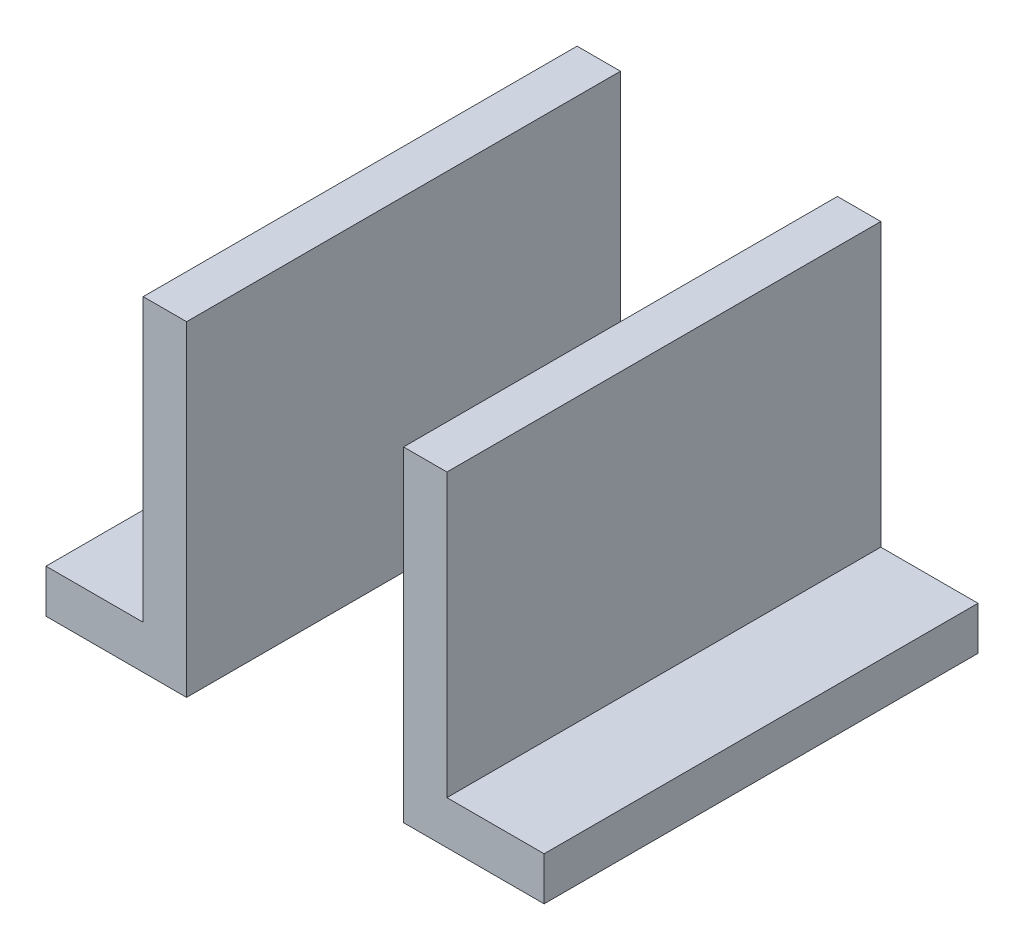
ISO-10303-21;
HEADER;
FILE_DESCRIPTION(('STEP AP214'),'2;1');
FILE_NAME('part.step','',(''),(''),'','','');
FILE_SCHEMA(('AUTOMOTIVE_DESIGN { 1 0 10303 214 1 1 1 1 }'));
ENDSEC;
DATA;
#1=APPLICATION_CONTEXT('core data for automotive mechanical design processes');
#2=APPLICATION_PROTOCOL_DEFINITION('international standard','automotive_design',2000,#1);
#3=PRODUCT_CONTEXT('',#1,'mechanical');
#4=PRODUCT('Part','Part','',(#3));
#5=PRODUCT_RELATED_PRODUCT_CATEGORY('part','',(#4));
#6=PRODUCT_DEFINITION_FORMATION('','',#4);
#7=PRODUCT_DEFINITION_CONTEXT('part definition',#1,'design');
#8=PRODUCT_DEFINITION('design','',#6,#7);
#9=PRODUCT_DEFINITION_SHAPE('','',#8);
#10=(LENGTH_UNIT() NAMED_UNIT(*) SI_UNIT(.MILLI.,.METRE.));
#11=(NAMED_UNIT(*) PLANE_ANGLE_UNIT() SI_UNIT($,.RADIAN.));
#12=(NAMED_UNIT(*) SI_UNIT($,.STERADIAN.) SOLID_ANGLE_UNIT());
#13=UNCERTAINTY_MEASURE_WITH_UNIT(LENGTH_MEASURE(1.E-05),#10,'distance_accuracy_value','');
#14=(GEOMETRIC_REPRESENTATION_CONTEXT(3) GLOBAL_UNCERTAINTY_ASSIGNED_CONTEXT((#13)) GLOBAL_UNIT_ASSIGNED_CONTEXT((#10,
#11,#12)) REPRESENTATION_CONTEXT('',''));
#15=CARTESIAN_POINT('',(0.,0.,0.));
#16=DIRECTION('',(0.,0.,1.));
#17=DIRECTION('',(1.,0.,0.));
#18=AXIS2_PLACEMENT_3D('',#15,#16,#17);
#19=CARTESIAN_POINT('',(-57.4040103991189,-35.4855461768779,100.));
#20=DIRECTION('',(1.,0.,0.));
#21=DIRECTION('',(0.,1.,0.));
#22=AXIS2_PLACEMENT_3D('',#19,#20,#21);
#23=PLANE('',#22);
#24=DIRECTION('',(0.,-1.,0.));
#25=VECTOR('',#24,1.);
#26=CARTESIAN_POINT('',(-57.4040103991189,-35.4855461768779,0.));
#27=LINE('',#26,#25);
#28=CARTESIAN_POINT('',(-57.4040103991189,-35.4855461768779,0.));
#29=VERTEX_POINT('',#28);
#30=CARTESIAN_POINT('',(-57.4040103991189,-45.4855461768779,0.));
#31=VERTEX_POINT('',#30);
#32=EDGE_CURVE('E129',#29,#31,#27,.T.);
#33=ORIENTED_EDGE('',*,*,#32,.T.);
#34=DIRECTION('',(0.,0.,-1.));
#35=VECTOR('',#34,1.);
#36=CARTESIAN_POINT('',(-57.4040103991189,-45.4855461768779,100.));
#37=LINE('',#36,#35);
#38=CARTESIAN_POINT('',(-57.4040103991189,-45.4855461768779,100.));
#39=VERTEX_POINT('',#38);
#40=EDGE_CURVE('E12',#39,#31,#37,.T.);
#41=ORIENTED_EDGE('',*,*,#40,.F.);
#42=DIRECTION('',(0.,-1.,0.));
#43=VECTOR('',#42,1.);
#44=CARTESIAN_POINT('',(-57.4040103991189,-35.4855461768779,100.));
#45=LINE('',#44,#43);
#46=CARTESIAN_POINT('',(-57.4040103991189,-35.4855461768779,100.));
#47=VERTEX_POINT('',#46);
#48=EDGE_CURVE('E139',#47,#39,#45,.T.);
#49=ORIENTED_EDGE('',*,*,#48,.F.);
#50=DIRECTION('',(0.,0.,-1.));
#51=VECTOR('',#50,1.);
#52=CARTESIAN_POINT('',(-57.4040103991189,-35.4855461768779,100.));
#53=LINE('',#52,#51);
#54=EDGE_CURVE('E125',#47,#29,#53,.T.);
#55=ORIENTED_EDGE('',*,*,#54,.T.);
#56=EDGE_LOOP('',(#33,#41,#49,#55));
#57=FACE_BOUND('',#56,.T.);
#58=ADVANCED_FACE('F45',(#57),#23,.F.);
#59=CARTESIAN_POINT('',(-57.4040103991189,-45.4855461768779,100.));
#60=DIRECTION('',(0.,1.,0.));
#61=DIRECTION('',(0.,0.,1.));
#62=AXIS2_PLACEMENT_3D('',#59,#60,#61);
#63=PLANE('',#62);
#64=DIRECTION('',(1.,0.,0.));
#65=VECTOR('',#64,1.);
#66=CARTESIAN_POINT('',(-57.4040103991189,-45.4855461768779,0.));
#67=LINE('',#66,#65);
#68=CARTESIAN_POINT('',(-25.,-45.4855461768779,0.));
#69=VERTEX_POINT('',#68);
#70=EDGE_CURVE('E132',#31,#69,#67,.T.);
#71=ORIENTED_EDGE('',*,*,#70,.T.);
#72=DIRECTION('',(0.,0.,-1.));
#73=VECTOR('',#72,1.);
#74=CARTESIAN_POINT('',(-25.,-45.4855461768779,100.));
#75=LINE('',#74,#73);
#76=CARTESIAN_POINT('',(-25.,-45.4855461768779,100.));
#77=VERTEX_POINT('',#76);
#78=EDGE_CURVE('E53',#77,#69,#75,.T.);
#79=ORIENTED_EDGE('',*,*,#78,.F.);
#80=DIRECTION('',(1.,0.,0.));
#81=VECTOR('',#80,1.);
#82=CARTESIAN_POINT('',(-57.4040103991189,-45.4855461768779,100.));
#83=LINE('',#82,#81);
#84=EDGE_CURVE('E98',#39,#77,#83,.T.);
#85=ORIENTED_EDGE('',*,*,#84,.F.);
#86=ORIENTED_EDGE('',*,*,#40,.T.);
#87=EDGE_LOOP('',(#71,#79,#85,#86));
#88=FACE_BOUND('',#87,.T.);
#89=ADVANCED_FACE('F163',(#88),#63,.F.);
#90=CARTESIAN_POINT('',(-25.,29.5144538231221,100.));
#91=DIRECTION('',(-1.,0.,0.));
#92=DIRECTION('',(0.,-1.,0.));
#93=AXIS2_PLACEMENT_3D('',#90,#91,#92);
#94=PLANE('',#93);
#95=DIRECTION('',(0.,1.,0.));
#96=VECTOR('',#95,1.);
#97=CARTESIAN_POINT('',(-25.,29.5144538231221,0.));
#98=LINE('',#97,#96);
#99=CARTESIAN_POINT('',(-25.,29.5144538231221,0.));
#100=VERTEX_POINT('',#99);
#101=EDGE_CURVE('E134',#69,#100,#98,.T.);
#102=ORIENTED_EDGE('',*,*,#101,.T.);
#103=DIRECTION('',(0.,0.,-1.));
#104=VECTOR('',#103,1.);
#105=CARTESIAN_POINT('',(-25.,29.5144538231221,100.));
#106=LINE('',#105,#104);
#107=CARTESIAN_POINT('',(-25.,29.5144538231221,100.));
#108=VERTEX_POINT('',#107);
#109=EDGE_CURVE('E120',#108,#100,#106,.T.);
#110=ORIENTED_EDGE('',*,*,#109,.F.);
#111=DIRECTION('',(0.,1.,0.));
#112=VECTOR('',#111,1.);
#113=CARTESIAN_POINT('',(-25.,29.5144538231221,100.));
#114=LINE('',#113,#112);
#115=EDGE_CURVE('E111',#77,#108,#114,.T.);
#116=ORIENTED_EDGE('',*,*,#115,.F.);
#117=ORIENTED_EDGE('',*,*,#78,.T.);
#118=EDGE_LOOP('',(#102,#110,#116,#117));
#119=FACE_BOUND('',#118,.T.);
#120=ADVANCED_FACE('F145',(#119),#94,.F.);
#121=CARTESIAN_POINT('',(-25.,29.5144538231221,100.));
#122=DIRECTION('',(0.,-1.,0.));
#123=DIRECTION('',(0.,0.,-1.));
#124=AXIS2_PLACEMENT_3D('',#121,#122,#123);
#125=PLANE('',#124);
#126=DIRECTION('',(-1.,0.,0.));
#127=VECTOR('',#126,1.);
#128=CARTESIAN_POINT('',(-25.,29.5144538231221,0.));
#129=LINE('',#128,#127);
#130=CARTESIAN_POINT('',(-35.,29.5144538231221,0.));
#131=VERTEX_POINT('',#130);
#132=EDGE_CURVE('E119',#100,#131,#129,.T.);
#133=ORIENTED_EDGE('',*,*,#132,.T.);
#134=DIRECTION('',(0.,0.,-1.));
#135=VECTOR('',#134,1.);
#136=CARTESIAN_POINT('',(-35.,29.5144538231221,100.));
#137=LINE('',#136,#135);
#138=CARTESIAN_POINT('',(-35.,29.5144538231221,100.));
#139=VERTEX_POINT('',#138);
#140=EDGE_CURVE('E116',#139,#131,#137,.T.);
#141=ORIENTED_EDGE('',*,*,#140,.F.);
#142=DIRECTION('',(-1.,0.,0.));
#143=VECTOR('',#142,1.);
#144=CARTESIAN_POINT('',(-25.,29.5144538231221,100.));
#145=LINE('',#144,#143);
#146=EDGE_CURVE('E105',#108,#139,#145,.T.);
#147=ORIENTED_EDGE('',*,*,#146,.F.);
#148=ORIENTED_EDGE('',*,*,#109,.T.);
#149=EDGE_LOOP('',(#133,#141,#147,#148));
#150=FACE_BOUND('',#149,.T.);
#151=ADVANCED_FACE('F117',(#150),#125,.F.);
#152=CARTESIAN_POINT('',(-35.,29.5144538231221,100.));
#153=DIRECTION('',(1.,0.,0.));
#154=DIRECTION('',(0.,1.,0.));
#155=AXIS2_PLACEMENT_3D('',#152,#153,#154);
#156=PLANE('',#155);
#157=DIRECTION('',(0.,-1.,0.));
#158=VECTOR('',#157,1.);
#159=CARTESIAN_POINT('',(-35.,29.5144538231221,0.));
#160=LINE('',#159,#158);
#161=CARTESIAN_POINT('',(-35.,-35.4855461768779,0.));
#162=VERTEX_POINT('',#161);
#163=EDGE_CURVE('E84',#131,#162,#160,.T.);
#164=ORIENTED_EDGE('',*,*,#163,.T.);
#165=DIRECTION('',(0.,0.,-1.));
#166=VECTOR('',#165,1.);
#167=CARTESIAN_POINT('',(-35.,-35.4855461768779,100.));
#168=LINE('',#167,#166);
#169=CARTESIAN_POINT('',(-35.,-35.4855461768779,100.));
#170=VERTEX_POINT('',#169);
#171=EDGE_CURVE('E121',#170,#162,#168,.T.);
#172=ORIENTED_EDGE('',*,*,#171,.F.);
#173=DIRECTION('',(0.,-1.,0.));
#174=VECTOR('',#173,1.);
#175=CARTESIAN_POINT('',(-35.,29.5144538231221,100.));
#176=LINE('',#175,#174);
#177=EDGE_CURVE('E109',#139,#170,#176,.T.);
#178=ORIENTED_EDGE('',*,*,#177,.F.);
#179=ORIENTED_EDGE('',*,*,#140,.T.);
#180=EDGE_LOOP('',(#164,#172,#178,#179));
#181=FACE_BOUND('',#180,.T.);
#182=ADVANCED_FACE('F123',(#181),#156,.F.);
#183=CARTESIAN_POINT('',(-35.,-35.4855461768779,100.));
#184=DIRECTION('',(0.,-1.,0.));
#185=DIRECTION('',(0.,0.,-1.));
#186=AXIS2_PLACEMENT_3D('',#183,#184,#185);
#187=PLANE('',#186);
#188=DIRECTION('',(-1.,0.,0.));
#189=VECTOR('',#188,1.);
#190=CARTESIAN_POINT('',(-35.,-35.4855461768779,0.));
#191=LINE('',#190,#189);
#192=EDGE_CURVE('E90',#162,#29,#191,.T.);
#193=ORIENTED_EDGE('',*,*,#192,.T.);
#194=ORIENTED_EDGE('',*,*,#54,.F.);
#195=DIRECTION('',(-1.,0.,0.));
#196=VECTOR('',#195,1.);
#197=CARTESIAN_POINT('',(-35.,-35.4855461768779,100.));
#198=LINE('',#197,#196);
#199=EDGE_CURVE('E61',#170,#47,#198,.T.);
#200=ORIENTED_EDGE('',*,*,#199,.F.);
#201=ORIENTED_EDGE('',*,*,#171,.T.);
#202=EDGE_LOOP('',(#193,#194,#200,#201));
#203=FACE_BOUND('',#202,.T.);
#204=ADVANCED_FACE('F152',(#203),#187,.F.);
#205=CARTESIAN_POINT('',(0.,0.,100.));
#206=DIRECTION('',(0.,0.,1.));
#207=DIRECTION('',(1.,0.,0.));
#208=AXIS2_PLACEMENT_3D('',#205,#206,#207);
#209=PLANE('',#208);
#210=ORIENTED_EDGE('',*,*,#48,.T.);
#211=ORIENTED_EDGE('',*,*,#84,.T.);
#212=ORIENTED_EDGE('',*,*,#115,.T.);
#213=ORIENTED_EDGE('',*,*,#146,.T.);
#214=ORIENTED_EDGE('',*,*,#177,.T.);
#215=ORIENTED_EDGE('',*,*,#199,.T.);
#216=EDGE_LOOP('',(#210,#211,#212,#213,#214,#215));
#217=FACE_BOUND('',#216,.T.);
#218=ADVANCED_FACE('F107',(#217),#209,.T.);
#219=CARTESIAN_POINT('',(0.,0.,0.));
#220=DIRECTION('',(0.,0.,1.));
#221=DIRECTION('',(1.,0.,0.));
#222=AXIS2_PLACEMENT_3D('',#219,#220,#221);
#223=PLANE('',#222);
#224=ORIENTED_EDGE('',*,*,#32,.F.);
#225=ORIENTED_EDGE('',*,*,#192,.F.);
#226=ORIENTED_EDGE('',*,*,#163,.F.);
#227=ORIENTED_EDGE('',*,*,#132,.F.);
#228=ORIENTED_EDGE('',*,*,#101,.F.);
#229=ORIENTED_EDGE('',*,*,#70,.F.);
#230=EDGE_LOOP('',(#224,#225,#226,#227,#228,#229));
#231=FACE_BOUND('',#230,.T.);
#232=ADVANCED_FACE('F148',(#231),#223,.F.);
#233=CLOSED_SHELL('',(#58,#89,#120,#151,#182,#204,#218,#232));
#234=MANIFOLD_SOLID_BREP('B2',#233);
#235=CARTESIAN_POINT('',(25.,29.5144538231221,100.));
#236=DIRECTION('',(1.,0.,0.));
#237=DIRECTION('',(0.,1.,0.));
#238=AXIS2_PLACEMENT_3D('',#235,#236,#237);
#239=PLANE('',#238);
#240=DIRECTION('',(0.,-1.,0.));
#241=VECTOR('',#240,1.);
#242=CARTESIAN_POINT('',(25.,29.5144538231221,0.));
#243=LINE('',#242,#241);
#244=CARTESIAN_POINT('',(25.,29.5144538231221,0.));
#245=VERTEX_POINT('',#244);
#246=CARTESIAN_POINT('',(25.,-45.4855461768779,0.));
#247=VERTEX_POINT('',#246);
#248=EDGE_CURVE('E305',#245,#247,#243,.T.);
#249=ORIENTED_EDGE('',*,*,#248,.T.);
#250=DIRECTION('',(0.,0.,-1.));
#251=VECTOR('',#250,1.);
#252=CARTESIAN_POINT('',(25.,-45.4855461768779,100.));
#253=LINE('',#252,#251);
#254=CARTESIAN_POINT('',(25.,-45.4855461768779,100.));
#255=VERTEX_POINT('',#254);
#256=EDGE_CURVE('E43',#255,#247,#253,.T.);
#257=ORIENTED_EDGE('',*,*,#256,.F.);
#258=DIRECTION('',(0.,-1.,0.));
#259=VECTOR('',#258,1.);
#260=CARTESIAN_POINT('',(25.,29.5144538231221,100.));
#261=LINE('',#260,#259);
#262=CARTESIAN_POINT('',(25.,29.5144538231221,100.));
#263=VERTEX_POINT('',#262);
#264=EDGE_CURVE('E315',#263,#255,#261,.T.);
#265=ORIENTED_EDGE('',*,*,#264,.F.);
#266=DIRECTION('',(0.,0.,-1.));
#267=VECTOR('',#266,1.);
#268=CARTESIAN_POINT('',(25.,29.5144538231221,100.));
#269=LINE('',#268,#267);
#270=EDGE_CURVE('E301',#263,#245,#269,.T.);
#271=ORIENTED_EDGE('',*,*,#270,.T.);
#272=EDGE_LOOP('',(#249,#257,#265,#271));
#273=FACE_BOUND('',#272,.T.);
#274=ADVANCED_FACE('F221',(#273),#239,.F.);
#275=CARTESIAN_POINT('',(57.4040103991189,-45.4855461768779,100.));
#276=DIRECTION('',(0.,1.,0.));
#277=DIRECTION('',(0.,0.,1.));
#278=AXIS2_PLACEMENT_3D('',#275,#276,#277);
#279=PLANE('',#278);
#280=DIRECTION('',(1.,0.,0.));
#281=VECTOR('',#280,1.);
#282=CARTESIAN_POINT('',(57.4040103991189,-45.4855461768779,0.));
#283=LINE('',#282,#281);
#284=CARTESIAN_POINT('',(57.4040103991189,-45.4855461768779,0.));
#285=VERTEX_POINT('',#284);
#286=EDGE_CURVE('E308',#247,#285,#283,.T.);
#287=ORIENTED_EDGE('',*,*,#286,.T.);
#288=DIRECTION('',(0.,0.,-1.));
#289=VECTOR('',#288,1.);
#290=CARTESIAN_POINT('',(57.4040103991189,-45.4855461768779,100.));
#291=LINE('',#290,#289);
#292=CARTESIAN_POINT('',(57.4040103991189,-45.4855461768779,100.));
#293=VERTEX_POINT('',#292);
#294=EDGE_CURVE('E229',#293,#285,#291,.T.);
#295=ORIENTED_EDGE('',*,*,#294,.F.);
#296=DIRECTION('',(1.,0.,0.));
#297=VECTOR('',#296,1.);
#298=CARTESIAN_POINT('',(57.4040103991189,-45.4855461768779,100.));
#299=LINE('',#298,#297);
#300=EDGE_CURVE('E274',#255,#293,#299,.T.);
#301=ORIENTED_EDGE('',*,*,#300,.F.);
#302=ORIENTED_EDGE('',*,*,#256,.T.);
#303=EDGE_LOOP('',(#287,#295,#301,#302));
#304=FACE_BOUND('',#303,.T.);
#305=ADVANCED_FACE('F339',(#304),#279,.F.);
#306=CARTESIAN_POINT('',(57.4040103991189,-35.4855461768779,100.));
#307=DIRECTION('',(-1.,0.,0.));
#308=DIRECTION('',(0.,-1.,0.));
#309=AXIS2_PLACEMENT_3D('',#306,#307,#308);
#310=PLANE('',#309);
#311=DIRECTION('',(0.,1.,0.));
#312=VECTOR('',#311,1.);
#313=CARTESIAN_POINT('',(57.4040103991189,-35.4855461768779,0.));
#314=LINE('',#313,#312);
#315=CARTESIAN_POINT('',(57.4040103991189,-35.4855461768779,0.));
#316=VERTEX_POINT('',#315);
#317=EDGE_CURVE('E310',#285,#316,#314,.T.);
#318=ORIENTED_EDGE('',*,*,#317,.T.);
#319=DIRECTION('',(0.,0.,-1.));
#320=VECTOR('',#319,1.);
#321=CARTESIAN_POINT('',(57.4040103991189,-35.4855461768779,100.));
#322=LINE('',#321,#320);
#323=CARTESIAN_POINT('',(57.4040103991189,-35.4855461768779,100.));
#324=VERTEX_POINT('',#323);
#325=EDGE_CURVE('E296',#324,#316,#322,.T.);
#326=ORIENTED_EDGE('',*,*,#325,.F.);
#327=DIRECTION('',(0.,1.,0.));
#328=VECTOR('',#327,1.);
#329=CARTESIAN_POINT('',(57.4040103991189,-35.4855461768779,100.));
#330=LINE('',#329,#328);
#331=EDGE_CURVE('E287',#293,#324,#330,.T.);
#332=ORIENTED_EDGE('',*,*,#331,.F.);
#333=ORIENTED_EDGE('',*,*,#294,.T.);
#334=EDGE_LOOP('',(#318,#326,#332,#333));
#335=FACE_BOUND('',#334,.T.);
#336=ADVANCED_FACE('F321',(#335),#310,.F.);
#337=CARTESIAN_POINT('',(35.,-35.4855461768779,100.));
#338=DIRECTION('',(0.,-1.,0.));
#339=DIRECTION('',(0.,0.,-1.));
#340=AXIS2_PLACEMENT_3D('',#337,#338,#339);
#341=PLANE('',#340);
#342=DIRECTION('',(-1.,0.,0.));
#343=VECTOR('',#342,1.);
#344=CARTESIAN_POINT('',(35.,-35.4855461768779,0.));
#345=LINE('',#344,#343);
#346=CARTESIAN_POINT('',(35.,-35.4855461768779,0.));
#347=VERTEX_POINT('',#346);
#348=EDGE_CURVE('E295',#316,#347,#345,.T.);
#349=ORIENTED_EDGE('',*,*,#348,.T.);
#350=DIRECTION('',(0.,0.,-1.));
#351=VECTOR('',#350,1.);
#352=CARTESIAN_POINT('',(35.,-35.4855461768779,100.));
#353=LINE('',#352,#351);
#354=CARTESIAN_POINT('',(35.,-35.4855461768779,100.));
#355=VERTEX_POINT('',#354);
#356=EDGE_CURVE('E292',#355,#347,#353,.T.);
#357=ORIENTED_EDGE('',*,*,#356,.F.);
#358=DIRECTION('',(-1.,0.,0.));
#359=VECTOR('',#358,1.);
#360=CARTESIAN_POINT('',(35.,-35.4855461768779,100.));
#361=LINE('',#360,#359);
#362=EDGE_CURVE('E281',#324,#355,#361,.T.);
#363=ORIENTED_EDGE('',*,*,#362,.F.);
#364=ORIENTED_EDGE('',*,*,#325,.T.);
#365=EDGE_LOOP('',(#349,#357,#363,#364));
#366=FACE_BOUND('',#365,.T.);
#367=ADVANCED_FACE('F293',(#366),#341,.F.);
#368=CARTESIAN_POINT('',(35.,29.5144538231221,100.));
#369=DIRECTION('',(-1.,0.,0.));
#370=DIRECTION('',(0.,-1.,0.));
#371=AXIS2_PLACEMENT_3D('',#368,#369,#370);
#372=PLANE('',#371);
#373=DIRECTION('',(0.,1.,0.));
#374=VECTOR('',#373,1.);
#375=CARTESIAN_POINT('',(35.,29.5144538231221,0.));
#376=LINE('',#375,#374);
#377=CARTESIAN_POINT('',(35.,29.5144538231221,0.));
#378=VERTEX_POINT('',#377);
#379=EDGE_CURVE('E260',#347,#378,#376,.T.);
#380=ORIENTED_EDGE('',*,*,#379,.T.);
#381=DIRECTION('',(0.,0.,-1.));
#382=VECTOR('',#381,1.);
#383=CARTESIAN_POINT('',(35.,29.5144538231221,100.));
#384=LINE('',#383,#382);
#385=CARTESIAN_POINT('',(35.,29.5144538231221,100.));
#386=VERTEX_POINT('',#385);
#387=EDGE_CURVE('E297',#386,#378,#384,.T.);
#388=ORIENTED_EDGE('',*,*,#387,.F.);
#389=DIRECTION('',(0.,1.,0.));
#390=VECTOR('',#389,1.);
#391=CARTESIAN_POINT('',(35.,29.5144538231221,100.));
#392=LINE('',#391,#390);
#393=EDGE_CURVE('E285',#355,#386,#392,.T.);
#394=ORIENTED_EDGE('',*,*,#393,.F.);
#395=ORIENTED_EDGE('',*,*,#356,.T.);
#396=EDGE_LOOP('',(#380,#388,#394,#395));
#397=FACE_BOUND('',#396,.T.);
#398=ADVANCED_FACE('F299',(#397),#372,.F.);
#399=CARTESIAN_POINT('',(25.,29.5144538231221,100.));
#400=DIRECTION('',(0.,-1.,0.));
#401=DIRECTION('',(0.,0.,-1.));
#402=AXIS2_PLACEMENT_3D('',#399,#400,#401);
#403=PLANE('',#402);
#404=DIRECTION('',(-1.,0.,0.));
#405=VECTOR('',#404,1.);
#406=CARTESIAN_POINT('',(25.,29.5144538231221,0.));
#407=LINE('',#406,#405);
#408=EDGE_CURVE('E266',#378,#245,#407,.T.);
#409=ORIENTED_EDGE('',*,*,#408,.T.);
#410=ORIENTED_EDGE('',*,*,#270,.F.);
#411=DIRECTION('',(-1.,0.,0.));
#412=VECTOR('',#411,1.);
#413=CARTESIAN_POINT('',(25.,29.5144538231221,100.));
#414=LINE('',#413,#412);
#415=EDGE_CURVE('E237',#386,#263,#414,.T.);
#416=ORIENTED_EDGE('',*,*,#415,.F.);
#417=ORIENTED_EDGE('',*,*,#387,.T.);
#418=EDGE_LOOP('',(#409,#410,#416,#417));
#419=FACE_BOUND('',#418,.T.);
#420=ADVANCED_FACE('F328',(#419),#403,.F.);
#421=CARTESIAN_POINT('',(0.,0.,100.));
#422=DIRECTION('',(0.,0.,-1.));
#423=DIRECTION('',(-1.,0.,0.));
#424=AXIS2_PLACEMENT_3D('',#421,#422,#423);
#425=PLANE('',#424);
#426=ORIENTED_EDGE('',*,*,#264,.T.);
#427=ORIENTED_EDGE('',*,*,#300,.T.);
#428=ORIENTED_EDGE('',*,*,#331,.T.);
#429=ORIENTED_EDGE('',*,*,#362,.T.);
#430=ORIENTED_EDGE('',*,*,#393,.T.);
#431=ORIENTED_EDGE('',*,*,#415,.T.);
#432=EDGE_LOOP('',(#426,#427,#428,#429,#430,#431));
#433=FACE_BOUND('',#432,.T.);
#434=ADVANCED_FACE('F283',(#433),#425,.F.);
#435=CARTESIAN_POINT('',(0.,0.,0.));
#436=DIRECTION('',(0.,0.,-1.));
#437=DIRECTION('',(-1.,0.,0.));
#438=AXIS2_PLACEMENT_3D('',#435,#436,#437);
#439=PLANE('',#438);
#440=ORIENTED_EDGE('',*,*,#248,.F.);
#441=ORIENTED_EDGE('',*,*,#408,.F.);
#442=ORIENTED_EDGE('',*,*,#379,.F.);
#443=ORIENTED_EDGE('',*,*,#348,.F.);
#444=ORIENTED_EDGE('',*,*,#317,.F.);
#445=ORIENTED_EDGE('',*,*,#286,.F.);
#446=EDGE_LOOP('',(#440,#441,#442,#443,#444,#445));
#447=FACE_BOUND('',#446,.T.);
#448=ADVANCED_FACE('F324',(#447),#439,.T.);
#449=CLOSED_SHELL('',(#274,#305,#336,#367,#398,#420,#434,#448));
#450=MANIFOLD_SOLID_BREP('B6',#449);
#451=ADVANCED_BREP_SHAPE_REPRESENTATION('',(#18,#234,#450),#14);
#452=SHAPE_DEFINITION_REPRESENTATION(#9,#451);
ENDSEC;
END-ISO-10303-21;
